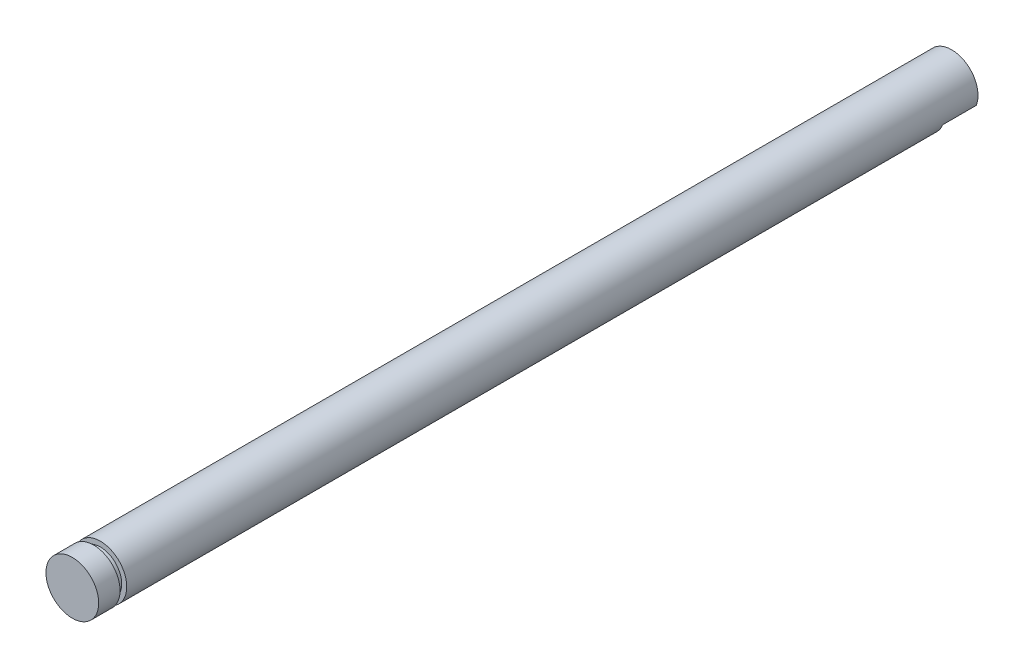
ISO-10303-21;
HEADER;
FILE_DESCRIPTION(('STEP AP214'),'2;1');
FILE_NAME('part.step','',(''),(''),'','','');
FILE_SCHEMA(('AUTOMOTIVE_DESIGN { 1 0 10303 214 1 1 1 1 }'));
ENDSEC;
DATA;
#1=APPLICATION_CONTEXT('core data for automotive mechanical design processes');
#2=APPLICATION_PROTOCOL_DEFINITION('international standard','automotive_design',2000,#1);
#3=PRODUCT_CONTEXT('',#1,'mechanical');
#4=PRODUCT('Part','Part','',(#3));
#5=PRODUCT_RELATED_PRODUCT_CATEGORY('part','',(#4));
#6=PRODUCT_DEFINITION_FORMATION('','',#4);
#7=PRODUCT_DEFINITION_CONTEXT('part definition',#1,'design');
#8=PRODUCT_DEFINITION('design','',#6,#7);
#9=PRODUCT_DEFINITION_SHAPE('','',#8);
#10=(LENGTH_UNIT() NAMED_UNIT(*) SI_UNIT(.MILLI.,.METRE.));
#11=(NAMED_UNIT(*) PLANE_ANGLE_UNIT() SI_UNIT($,.RADIAN.));
#12=(NAMED_UNIT(*) SI_UNIT($,.STERADIAN.) SOLID_ANGLE_UNIT());
#13=UNCERTAINTY_MEASURE_WITH_UNIT(LENGTH_MEASURE(1.E-05),#10,'distance_accuracy_value','');
#14=(GEOMETRIC_REPRESENTATION_CONTEXT(3) GLOBAL_UNCERTAINTY_ASSIGNED_CONTEXT((#13)) GLOBAL_UNIT_ASSIGNED_CONTEXT((#10,
#11,#12)) REPRESENTATION_CONTEXT('',''));
#15=CARTESIAN_POINT('',(0.,0.,0.));
#16=DIRECTION('',(0.,0.,1.));
#17=DIRECTION('',(1.,0.,0.));
#18=AXIS2_PLACEMENT_3D('',#15,#16,#17);
#19=CARTESIAN_POINT('',(0.,0.,33.3375));
#20=DIRECTION('',(0.,0.,-1.));
#21=DIRECTION('',(-1.,0.,0.));
#22=AXIS2_PLACEMENT_3D('',#19,#20,#21);
#23=CYLINDRICAL_SURFACE('',#22,2.);
#24=CARTESIAN_POINT('',(0.,0.,-30.7975));
#25=DIRECTION('',(0.,0.,1.));
#26=DIRECTION('',(1.,0.,0.));
#27=AXIS2_PLACEMENT_3D('',#24,#25,#26);
#28=CIRCLE('',#27,2.);
#29=CARTESIAN_POINT('',(-1.86201503753326,-0.73,-30.7975));
#30=VERTEX_POINT('',#29);
#31=CARTESIAN_POINT('',(1.86201503753326,-0.73,-30.7975));
#32=VERTEX_POINT('',#31);
#33=EDGE_CURVE('E11',#30,#32,#28,.T.);
#34=ORIENTED_EDGE('',*,*,#33,.T.);
#35=DIRECTION('',(0.,0.,-1.));
#36=VECTOR('',#35,1.);
#37=CARTESIAN_POINT('',(1.86201503753326,-0.730000000000005,33.3375));
#38=LINE('',#37,#36);
#39=CARTESIAN_POINT('',(1.86201503753326,-0.73,-33.3375));
#40=VERTEX_POINT('',#39);
#41=EDGE_CURVE('E62',#32,#40,#38,.T.);
#42=ORIENTED_EDGE('',*,*,#41,.T.);
#43=CARTESIAN_POINT('',(0.,0.,-33.3375));
#44=DIRECTION('',(0.,0.,1.));
#45=DIRECTION('',(1.,0.,0.));
#46=AXIS2_PLACEMENT_3D('',#43,#44,#45);
#47=CIRCLE('',#46,2.);
#48=CARTESIAN_POINT('',(-1.86201503753326,-0.73,-33.3375));
#49=VERTEX_POINT('',#48);
#50=EDGE_CURVE('E67',#40,#49,#47,.T.);
#51=ORIENTED_EDGE('',*,*,#50,.T.);
#52=DIRECTION('',(0.,0.,-1.));
#53=VECTOR('',#52,1.);
#54=CARTESIAN_POINT('',(-1.86201503753326,-0.730000000000005,33.3375));
#55=LINE('',#54,#53);
#56=EDGE_CURVE('E47',#49,#30,#55,.F.);
#57=ORIENTED_EDGE('',*,*,#56,.T.);
#58=EDGE_LOOP('',(#34,#42,#51,#57));
#59=FACE_BOUND('',#58,.T.);
#60=CARTESIAN_POINT('',(0.,0.,31.21025));
#61=DIRECTION('',(0.,0.,1.));
#62=DIRECTION('',(1.,0.,0.));
#63=AXIS2_PLACEMENT_3D('',#60,#61,#62);
#64=CIRCLE('',#63,2.);
#65=CARTESIAN_POINT('',(2.,0.,31.21025));
#66=VERTEX_POINT('',#65);
#67=EDGE_CURVE('E69',#66,#66,#64,.T.);
#68=ORIENTED_EDGE('',*,*,#67,.F.);
#69=EDGE_LOOP('',(#68));
#70=FACE_BOUND('',#69,.T.);
#71=ADVANCED_FACE('F33',(#59,#70),#23,.T.);
#72=CARTESIAN_POINT('',(0.,0.,-33.3375));
#73=DIRECTION('',(0.,0.,1.));
#74=DIRECTION('',(1.,0.,0.));
#75=AXIS2_PLACEMENT_3D('',#72,#73,#74);
#76=PLANE('',#75);
#77=ORIENTED_EDGE('',*,*,#50,.F.);
#78=DIRECTION('',(-1.,0.,0.));
#79=VECTOR('',#78,1.);
#80=CARTESIAN_POINT('',(0.,-0.73,-33.3375));
#81=LINE('',#80,#79);
#82=EDGE_CURVE('E40',#40,#49,#81,.T.);
#83=ORIENTED_EDGE('',*,*,#82,.T.);
#84=EDGE_LOOP('',(#77,#83));
#85=FACE_BOUND('',#84,.T.);
#86=ADVANCED_FACE('F87',(#85),#76,.F.);
#87=CARTESIAN_POINT('',(0.,2.,31.21025));
#88=DIRECTION('',(0.,0.,1.));
#89=DIRECTION('',(1.,0.,0.));
#90=AXIS2_PLACEMENT_3D('',#87,#88,#89);
#91=PLANE('',#90);
#92=ORIENTED_EDGE('',*,*,#67,.T.);
#93=EDGE_LOOP('',(#92));
#94=FACE_BOUND('',#93,.T.);
#95=CARTESIAN_POINT('',(0.,0.,31.21025));
#96=DIRECTION('',(0.,0.,1.));
#97=DIRECTION('',(1.,0.,0.));
#98=AXIS2_PLACEMENT_3D('',#95,#96,#97);
#99=CIRCLE('',#98,1.619);
#100=CARTESIAN_POINT('',(1.619,0.,31.21025));
#101=VERTEX_POINT('',#100);
#102=EDGE_CURVE('E80',#101,#101,#99,.T.);
#103=ORIENTED_EDGE('',*,*,#102,.F.);
#104=EDGE_LOOP('',(#103));
#105=FACE_BOUND('',#104,.T.);
#106=ADVANCED_FACE('F89',(#94,#105),#91,.T.);
#107=CARTESIAN_POINT('',(0.,0.,33.3375));
#108=DIRECTION('',(0.,0.,1.));
#109=DIRECTION('',(1.,0.,0.));
#110=AXIS2_PLACEMENT_3D('',#107,#108,#109);
#111=CYLINDRICAL_SURFACE('',#110,1.619);
#112=ORIENTED_EDGE('',*,*,#102,.T.);
#113=EDGE_LOOP('',(#112));
#114=FACE_BOUND('',#113,.T.);
#115=CARTESIAN_POINT('',(0.,0.,31.71825));
#116=DIRECTION('',(0.,0.,1.));
#117=DIRECTION('',(1.,0.,0.));
#118=AXIS2_PLACEMENT_3D('',#115,#116,#117);
#119=CIRCLE('',#118,1.619);
#120=CARTESIAN_POINT('',(1.619,0.,31.71825));
#121=VERTEX_POINT('',#120);
#122=EDGE_CURVE('E77',#121,#121,#119,.T.);
#123=ORIENTED_EDGE('',*,*,#122,.F.);
#124=EDGE_LOOP('',(#123));
#125=FACE_BOUND('',#124,.T.);
#126=ADVANCED_FACE('F94',(#114,#125),#111,.T.);
#127=CARTESIAN_POINT('',(0.,2.,31.71825));
#128=DIRECTION('',(0.,0.,-1.));
#129=DIRECTION('',(-1.,0.,0.));
#130=AXIS2_PLACEMENT_3D('',#127,#128,#129);
#131=PLANE('',#130);
#132=ORIENTED_EDGE('',*,*,#122,.T.);
#133=EDGE_LOOP('',(#132));
#134=FACE_BOUND('',#133,.T.);
#135=CARTESIAN_POINT('',(0.,0.,31.71825));
#136=DIRECTION('',(0.,0.,1.));
#137=DIRECTION('',(1.,0.,0.));
#138=AXIS2_PLACEMENT_3D('',#135,#136,#137);
#139=CIRCLE('',#138,2.);
#140=CARTESIAN_POINT('',(2.,0.,31.71825));
#141=VERTEX_POINT('',#140);
#142=EDGE_CURVE('E74',#141,#141,#139,.T.);
#143=ORIENTED_EDGE('',*,*,#142,.F.);
#144=EDGE_LOOP('',(#143));
#145=FACE_BOUND('',#144,.T.);
#146=ADVANCED_FACE('F101',(#134,#145),#131,.T.);
#147=CARTESIAN_POINT('',(0.,0.,33.3375));
#148=DIRECTION('',(0.,0.,1.));
#149=DIRECTION('',(1.,0.,0.));
#150=AXIS2_PLACEMENT_3D('',#147,#148,#149);
#151=PLANE('',#150);
#152=CARTESIAN_POINT('',(0.,0.,33.3375));
#153=DIRECTION('',(0.,0.,1.));
#154=DIRECTION('',(1.,0.,0.));
#155=AXIS2_PLACEMENT_3D('',#152,#153,#154);
#156=CIRCLE('',#155,2.);
#157=CARTESIAN_POINT('',(2.,0.,33.3375));
#158=VERTEX_POINT('',#157);
#159=EDGE_CURVE('E83',#158,#158,#156,.T.);
#160=ORIENTED_EDGE('',*,*,#159,.T.);
#161=EDGE_LOOP('',(#160));
#162=FACE_BOUND('',#161,.T.);
#163=ADVANCED_FACE('F99',(#162),#151,.T.);
#164=ORIENTED_EDGE('',*,*,#159,.F.);
#165=EDGE_LOOP('',(#164));
#166=FACE_BOUND('',#165,.T.);
#167=ORIENTED_EDGE('',*,*,#142,.T.);
#168=EDGE_LOOP('',(#167));
#169=FACE_BOUND('',#168,.T.);
#170=ADVANCED_FACE('F97',(#166,#169),#23,.T.);
#171=CARTESIAN_POINT('',(-2.,-0.73,-30.7975));
#172=DIRECTION('',(0.,0.,1.));
#173=DIRECTION('',(1.,0.,0.));
#174=AXIS2_PLACEMENT_3D('',#171,#172,#173);
#175=PLANE('',#174);
#176=DIRECTION('',(1.,0.,0.));
#177=VECTOR('',#176,1.);
#178=CARTESIAN_POINT('',(-2.,-0.73,-30.7975));
#179=LINE('',#178,#177);
#180=EDGE_CURVE('E59',#30,#32,#179,.T.);
#181=ORIENTED_EDGE('',*,*,#180,.T.);
#182=ORIENTED_EDGE('',*,*,#33,.F.);
#183=EDGE_LOOP('',(#181,#182));
#184=FACE_BOUND('',#183,.T.);
#185=ADVANCED_FACE('F58',(#184),#175,.F.);
#186=CARTESIAN_POINT('',(-2.,-0.73,-33.3375));
#187=DIRECTION('',(0.,1.,0.));
#188=DIRECTION('',(0.,0.,1.));
#189=AXIS2_PLACEMENT_3D('',#186,#187,#188);
#190=PLANE('',#189);
#191=ORIENTED_EDGE('',*,*,#180,.F.);
#192=ORIENTED_EDGE('',*,*,#56,.F.);
#193=ORIENTED_EDGE('',*,*,#82,.F.);
#194=ORIENTED_EDGE('',*,*,#41,.F.);
#195=EDGE_LOOP('',(#191,#192,#193,#194));
#196=FACE_BOUND('',#195,.T.);
#197=ADVANCED_FACE('F61',(#196),#190,.F.);
#198=CLOSED_SHELL('',(#71,#86,#106,#126,#146,#163,#170,#185,#197));
#199=MANIFOLD_SOLID_BREP('B2',#198);
#200=ADVANCED_BREP_SHAPE_REPRESENTATION('',(#18,#199),#14);
#201=SHAPE_DEFINITION_REPRESENTATION(#9,#200);
ENDSEC;
END-ISO-10303-21;
